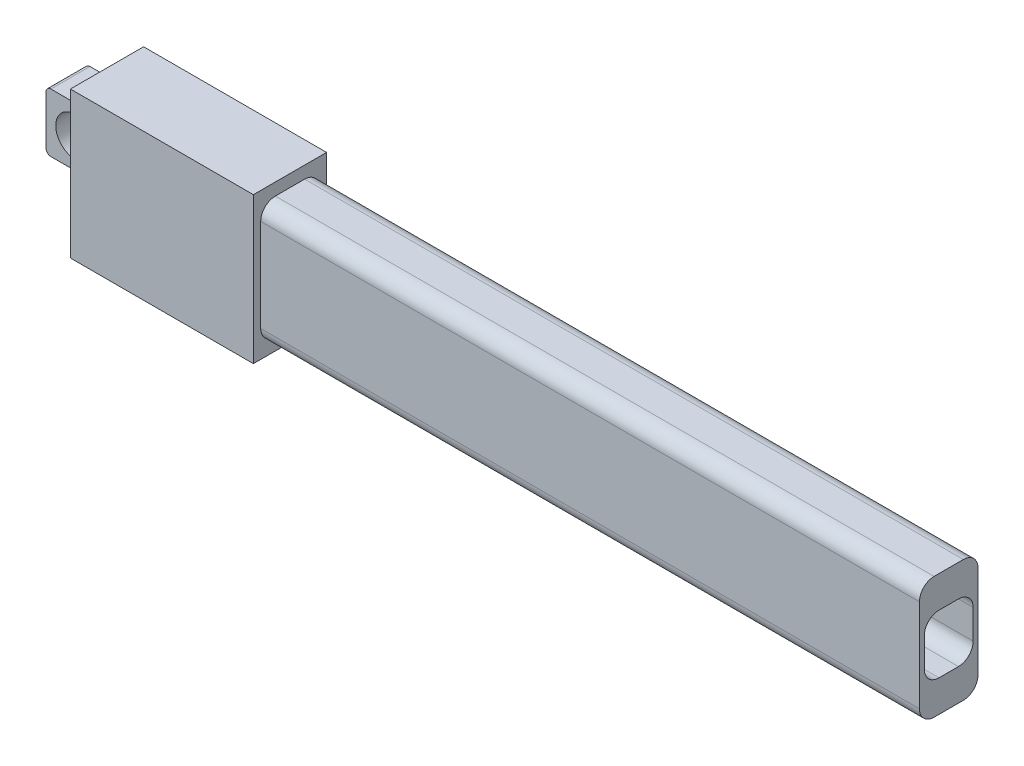
ISO-10303-21;
HEADER;
FILE_DESCRIPTION(('STEP AP214'),'2;1');
FILE_NAME('part.step','',(''),(''),'','','');
FILE_SCHEMA(('AUTOMOTIVE_DESIGN { 1 0 10303 214 1 1 1 1 }'));
ENDSEC;
DATA;
#1=APPLICATION_CONTEXT('core data for automotive mechanical design processes');
#2=APPLICATION_PROTOCOL_DEFINITION('international standard','automotive_design',2000,#1);
#3=PRODUCT_CONTEXT('',#1,'mechanical');
#4=PRODUCT('Part','Part','',(#3));
#5=PRODUCT_RELATED_PRODUCT_CATEGORY('part','',(#4));
#6=PRODUCT_DEFINITION_FORMATION('','',#4);
#7=PRODUCT_DEFINITION_CONTEXT('part definition',#1,'design');
#8=PRODUCT_DEFINITION('design','',#6,#7);
#9=PRODUCT_DEFINITION_SHAPE('','',#8);
#10=(LENGTH_UNIT() NAMED_UNIT(*) SI_UNIT(.MILLI.,.METRE.));
#11=(NAMED_UNIT(*) PLANE_ANGLE_UNIT() SI_UNIT($,.RADIAN.));
#12=(NAMED_UNIT(*) SI_UNIT($,.STERADIAN.) SOLID_ANGLE_UNIT());
#13=UNCERTAINTY_MEASURE_WITH_UNIT(LENGTH_MEASURE(1.E-05),#10,'distance_accuracy_value','');
#14=(GEOMETRIC_REPRESENTATION_CONTEXT(3) GLOBAL_UNCERTAINTY_ASSIGNED_CONTEXT((#13)) GLOBAL_UNIT_ASSIGNED_CONTEXT((#10,
#11,#12)) REPRESENTATION_CONTEXT('',''));
#15=CARTESIAN_POINT('',(0.,0.,0.));
#16=DIRECTION('',(0.,0.,1.));
#17=DIRECTION('',(1.,0.,0.));
#18=AXIS2_PLACEMENT_3D('',#15,#16,#17);
#19=CARTESIAN_POINT('',(18.75,-15.,15.));
#20=DIRECTION('',(-1.,0.,0.));
#21=DIRECTION('',(0.,0.,1.));
#22=AXIS2_PLACEMENT_3D('',#19,#20,#21);
#23=PLANE('',#22);
#24=DIRECTION('',(0.,1.,0.));
#25=VECTOR('',#24,1.);
#26=CARTESIAN_POINT('',(18.75,-15.,0.));
#27=LINE('',#26,#25);
#28=CARTESIAN_POINT('',(18.75,-15.,0.));
#29=VERTEX_POINT('',#28);
#30=CARTESIAN_POINT('',(18.75,15.,0.));
#31=VERTEX_POINT('',#30);
#32=EDGE_CURVE('E394',#29,#31,#27,.T.);
#33=ORIENTED_EDGE('',*,*,#32,.T.);
#34=DIRECTION('',(0.,0.,-1.));
#35=VECTOR('',#34,1.);
#36=CARTESIAN_POINT('',(18.75,15.,15.));
#37=LINE('',#36,#35);
#38=CARTESIAN_POINT('',(18.75,15.,15.));
#39=VERTEX_POINT('',#38);
#40=EDGE_CURVE('E11',#39,#31,#37,.T.);
#41=ORIENTED_EDGE('',*,*,#40,.F.);
#42=DIRECTION('',(0.,1.,0.));
#43=VECTOR('',#42,1.);
#44=CARTESIAN_POINT('',(18.75,-15.,15.));
#45=LINE('',#44,#43);
#46=CARTESIAN_POINT('',(18.75,-15.,15.));
#47=VERTEX_POINT('',#46);
#48=EDGE_CURVE('E395',#47,#39,#45,.T.);
#49=ORIENTED_EDGE('',*,*,#48,.F.);
#50=DIRECTION('',(0.,0.,-1.));
#51=VECTOR('',#50,1.);
#52=CARTESIAN_POINT('',(18.75,-15.,15.));
#53=LINE('',#52,#51);
#54=EDGE_CURVE('E405',#47,#29,#53,.T.);
#55=ORIENTED_EDGE('',*,*,#54,.T.);
#56=EDGE_LOOP('',(#33,#41,#49,#55));
#57=FACE_BOUND('',#56,.T.);
#58=CARTESIAN_POINT('',(18.75,-9.50000000000001,10.5));
#59=DIRECTION('',(1.,0.,0.));
#60=DIRECTION('',(0.,0.,1.));
#61=AXIS2_PLACEMENT_3D('',#58,#59,#60);
#62=CIRCLE('',#61,3.);
#63=CARTESIAN_POINT('',(18.75,-9.50000000000001,13.5));
#64=VERTEX_POINT('',#63);
#65=CARTESIAN_POINT('',(18.75,-12.5,10.5));
#66=VERTEX_POINT('',#65);
#67=EDGE_CURVE('E49',#64,#66,#62,.T.);
#68=ORIENTED_EDGE('',*,*,#67,.F.);
#69=DIRECTION('',(0.,-1.,0.));
#70=VECTOR('',#69,1.);
#71=CARTESIAN_POINT('',(18.75,-9.50000000000001,13.5));
#72=LINE('',#71,#70);
#73=CARTESIAN_POINT('',(18.75,9.5,13.5));
#74=VERTEX_POINT('',#73);
#75=EDGE_CURVE('E53',#74,#64,#72,.T.);
#76=ORIENTED_EDGE('',*,*,#75,.F.);
#77=CARTESIAN_POINT('',(18.75,9.5,10.5));
#78=DIRECTION('',(1.,0.,0.));
#79=DIRECTION('',(0.,0.,1.));
#80=AXIS2_PLACEMENT_3D('',#77,#78,#79);
#81=CIRCLE('',#80,3.);
#82=CARTESIAN_POINT('',(18.75,12.5,10.5));
#83=VERTEX_POINT('',#82);
#84=EDGE_CURVE('E320',#83,#74,#81,.T.);
#85=ORIENTED_EDGE('',*,*,#84,.F.);
#86=DIRECTION('',(0.,0.,1.));
#87=VECTOR('',#86,1.);
#88=CARTESIAN_POINT('',(18.75,12.5,10.5));
#89=LINE('',#88,#87);
#90=CARTESIAN_POINT('',(18.75,12.5,4.5));
#91=VERTEX_POINT('',#90);
#92=EDGE_CURVE('E317',#91,#83,#89,.T.);
#93=ORIENTED_EDGE('',*,*,#92,.F.);
#94=CARTESIAN_POINT('',(18.75,9.5,4.5));
#95=DIRECTION('',(1.,0.,0.));
#96=DIRECTION('',(0.,0.,1.));
#97=AXIS2_PLACEMENT_3D('',#94,#95,#96);
#98=CIRCLE('',#97,3.);
#99=CARTESIAN_POINT('',(18.75,9.5,1.5));
#100=VERTEX_POINT('',#99);
#101=EDGE_CURVE('E314',#100,#91,#98,.T.);
#102=ORIENTED_EDGE('',*,*,#101,.F.);
#103=DIRECTION('',(0.,1.,0.));
#104=VECTOR('',#103,1.);
#105=CARTESIAN_POINT('',(18.75,-9.50000000000001,1.5));
#106=LINE('',#105,#104);
#107=CARTESIAN_POINT('',(18.75,-9.50000000000001,1.5));
#108=VERTEX_POINT('',#107);
#109=EDGE_CURVE('E311',#108,#100,#106,.T.);
#110=ORIENTED_EDGE('',*,*,#109,.F.);
#111=CARTESIAN_POINT('',(18.75,-9.50000000000001,4.5));
#112=DIRECTION('',(1.,0.,0.));
#113=DIRECTION('',(0.,0.,-1.));
#114=AXIS2_PLACEMENT_3D('',#111,#112,#113);
#115=CIRCLE('',#114,3.);
#116=CARTESIAN_POINT('',(18.75,-12.5,4.5));
#117=VERTEX_POINT('',#116);
#118=EDGE_CURVE('E308',#117,#108,#115,.T.);
#119=ORIENTED_EDGE('',*,*,#118,.F.);
#120=DIRECTION('',(0.,0.,-1.));
#121=VECTOR('',#120,1.);
#122=CARTESIAN_POINT('',(18.75,-12.5,10.5));
#123=LINE('',#122,#121);
#124=EDGE_CURVE('E305',#66,#117,#123,.T.);
#125=ORIENTED_EDGE('',*,*,#124,.F.);
#126=EDGE_LOOP('',(#68,#76,#85,#93,#102,#110,#119,#125));
#127=FACE_BOUND('',#126,.T.);
#128=ADVANCED_FACE('F35',(#57,#127),#23,.F.);
#129=CARTESIAN_POINT('',(-18.75,-15.,15.));
#130=DIRECTION('',(1.,0.,0.));
#131=DIRECTION('',(0.,0.,-1.));
#132=AXIS2_PLACEMENT_3D('',#129,#130,#131);
#133=PLANE('',#132);
#134=DIRECTION('',(0.,0.,-1.));
#135=VECTOR('',#134,1.);
#136=CARTESIAN_POINT('',(-18.75,6.,8.));
#137=LINE('',#136,#135);
#138=CARTESIAN_POINT('',(-18.75,6.,8.));
#139=VERTEX_POINT('',#138);
#140=CARTESIAN_POINT('',(-18.75,6.,0.));
#141=VERTEX_POINT('',#140);
#142=EDGE_CURVE('E391',#139,#141,#137,.T.);
#143=ORIENTED_EDGE('',*,*,#142,.F.);
#144=DIRECTION('',(0.,1.,0.));
#145=VECTOR('',#144,1.);
#146=CARTESIAN_POINT('',(-18.75,6.,8.));
#147=LINE('',#146,#145);
#148=CARTESIAN_POINT('',(-18.75,-6.00000000000001,8.));
#149=VERTEX_POINT('',#148);
#150=EDGE_CURVE('E354',#149,#139,#147,.T.);
#151=ORIENTED_EDGE('',*,*,#150,.F.);
#152=DIRECTION('',(0.,0.,-1.));
#153=VECTOR('',#152,1.);
#154=CARTESIAN_POINT('',(-18.75,-6.00000000000001,8.));
#155=LINE('',#154,#153);
#156=CARTESIAN_POINT('',(-18.75,-6.00000000000001,0.));
#157=VERTEX_POINT('',#156);
#158=EDGE_CURVE('E368',#149,#157,#155,.T.);
#159=ORIENTED_EDGE('',*,*,#158,.T.);
#160=DIRECTION('',(0.,-1.,0.));
#161=VECTOR('',#160,1.);
#162=CARTESIAN_POINT('',(-18.75,-15.,0.));
#163=LINE('',#162,#161);
#164=CARTESIAN_POINT('',(-18.75,-15.,0.));
#165=VERTEX_POINT('',#164);
#166=EDGE_CURVE('E410',#157,#165,#163,.T.);
#167=ORIENTED_EDGE('',*,*,#166,.T.);
#168=DIRECTION('',(0.,0.,-1.));
#169=VECTOR('',#168,1.);
#170=CARTESIAN_POINT('',(-18.75,-15.,15.));
#171=LINE('',#170,#169);
#172=CARTESIAN_POINT('',(-18.75,-15.,15.));
#173=VERTEX_POINT('',#172);
#174=EDGE_CURVE('E417',#173,#165,#171,.T.);
#175=ORIENTED_EDGE('',*,*,#174,.F.);
#176=DIRECTION('',(0.,-1.,0.));
#177=VECTOR('',#176,1.);
#178=CARTESIAN_POINT('',(-18.75,-15.,15.));
#179=LINE('',#178,#177);
#180=CARTESIAN_POINT('',(-18.75,15.,15.));
#181=VERTEX_POINT('',#180);
#182=EDGE_CURVE('E401',#181,#173,#179,.T.);
#183=ORIENTED_EDGE('',*,*,#182,.F.);
#184=DIRECTION('',(0.,0.,-1.));
#185=VECTOR('',#184,1.);
#186=CARTESIAN_POINT('',(-18.75,15.,15.));
#187=LINE('',#186,#185);
#188=CARTESIAN_POINT('',(-18.75,15.,0.));
#189=VERTEX_POINT('',#188);
#190=EDGE_CURVE('E42',#181,#189,#187,.T.);
#191=ORIENTED_EDGE('',*,*,#190,.T.);
#192=EDGE_CURVE('E411',#189,#141,#163,.T.);
#193=ORIENTED_EDGE('',*,*,#192,.T.);
#194=EDGE_LOOP('',(#143,#151,#159,#167,#175,#183,#191,#193));
#195=FACE_BOUND('',#194,.T.);
#196=ADVANCED_FACE('F425',(#195),#133,.F.);
#197=CARTESIAN_POINT('',(-18.75,15.,15.));
#198=DIRECTION('',(0.,-1.,0.));
#199=DIRECTION('',(0.,0.,-1.));
#200=AXIS2_PLACEMENT_3D('',#197,#198,#199);
#201=PLANE('',#200);
#202=DIRECTION('',(-1.,0.,0.));
#203=VECTOR('',#202,1.);
#204=CARTESIAN_POINT('',(-18.75,15.,0.));
#205=LINE('',#204,#203);
#206=EDGE_CURVE('E408',#31,#189,#205,.T.);
#207=ORIENTED_EDGE('',*,*,#206,.T.);
#208=ORIENTED_EDGE('',*,*,#190,.F.);
#209=DIRECTION('',(-1.,0.,0.));
#210=VECTOR('',#209,1.);
#211=CARTESIAN_POINT('',(-18.75,15.,15.));
#212=LINE('',#211,#210);
#213=EDGE_CURVE('E398',#39,#181,#212,.T.);
#214=ORIENTED_EDGE('',*,*,#213,.F.);
#215=ORIENTED_EDGE('',*,*,#40,.T.);
#216=EDGE_LOOP('',(#207,#208,#214,#215));
#217=FACE_BOUND('',#216,.T.);
#218=ADVANCED_FACE('F459',(#217),#201,.F.);
#219=CARTESIAN_POINT('',(-18.75,-15.,15.));
#220=DIRECTION('',(0.,1.,0.));
#221=DIRECTION('',(0.,0.,1.));
#222=AXIS2_PLACEMENT_3D('',#219,#220,#221);
#223=PLANE('',#222);
#224=DIRECTION('',(1.,0.,0.));
#225=VECTOR('',#224,1.);
#226=CARTESIAN_POINT('',(-18.75,-15.,0.));
#227=LINE('',#226,#225);
#228=EDGE_CURVE('E399',#165,#29,#227,.T.);
#229=ORIENTED_EDGE('',*,*,#228,.T.);
#230=ORIENTED_EDGE('',*,*,#54,.F.);
#231=DIRECTION('',(1.,0.,0.));
#232=VECTOR('',#231,1.);
#233=CARTESIAN_POINT('',(-18.75,-15.,15.));
#234=LINE('',#233,#232);
#235=EDGE_CURVE('E403',#173,#47,#234,.T.);
#236=ORIENTED_EDGE('',*,*,#235,.F.);
#237=ORIENTED_EDGE('',*,*,#174,.T.);
#238=EDGE_LOOP('',(#229,#230,#236,#237));
#239=FACE_BOUND('',#238,.T.);
#240=ADVANCED_FACE('F453',(#239),#223,.F.);
#241=CARTESIAN_POINT('',(0.,0.,15.));
#242=DIRECTION('',(0.,0.,-1.));
#243=DIRECTION('',(-1.,0.,0.));
#244=AXIS2_PLACEMENT_3D('',#241,#242,#243);
#245=PLANE('',#244);
#246=ORIENTED_EDGE('',*,*,#48,.T.);
#247=ORIENTED_EDGE('',*,*,#213,.T.);
#248=ORIENTED_EDGE('',*,*,#182,.T.);
#249=ORIENTED_EDGE('',*,*,#235,.T.);
#250=EDGE_LOOP('',(#246,#247,#248,#249));
#251=FACE_BOUND('',#250,.T.);
#252=ADVANCED_FACE('F457',(#251),#245,.F.);
#253=CARTESIAN_POINT('',(0.,0.,0.));
#254=DIRECTION('',(0.,0.,-1.));
#255=DIRECTION('',(-1.,0.,0.));
#256=AXIS2_PLACEMENT_3D('',#253,#254,#255);
#257=PLANE('',#256);
#258=ORIENTED_EDGE('',*,*,#32,.F.);
#259=ORIENTED_EDGE('',*,*,#228,.F.);
#260=ORIENTED_EDGE('',*,*,#166,.F.);
#261=DIRECTION('',(1.,0.,0.));
#262=VECTOR('',#261,1.);
#263=CARTESIAN_POINT('',(-18.75,-6.00000000000001,0.));
#264=LINE('',#263,#262);
#265=CARTESIAN_POINT('',(-29.75,-6.00000000000001,0.));
#266=VERTEX_POINT('',#265);
#267=EDGE_CURVE('E358',#266,#157,#264,.T.);
#268=ORIENTED_EDGE('',*,*,#267,.F.);
#269=CARTESIAN_POINT('',(-29.75,-5.,0.));
#270=DIRECTION('',(0.,0.,1.));
#271=DIRECTION('',(-1.,0.,0.));
#272=AXIS2_PLACEMENT_3D('',#269,#270,#271);
#273=CIRCLE('',#272,1.);
#274=CARTESIAN_POINT('',(-30.75,-5.,0.));
#275=VERTEX_POINT('',#274);
#276=EDGE_CURVE('E374',#275,#266,#273,.T.);
#277=ORIENTED_EDGE('',*,*,#276,.F.);
#278=DIRECTION('',(0.,-1.,0.));
#279=VECTOR('',#278,1.);
#280=CARTESIAN_POINT('',(-30.75,5.,0.));
#281=LINE('',#280,#279);
#282=CARTESIAN_POINT('',(-30.75,5.,0.));
#283=VERTEX_POINT('',#282);
#284=EDGE_CURVE('E372',#283,#275,#281,.T.);
#285=ORIENTED_EDGE('',*,*,#284,.F.);
#286=CARTESIAN_POINT('',(-29.75,5.,0.));
#287=DIRECTION('',(0.,0.,1.));
#288=DIRECTION('',(1.,0.,0.));
#289=AXIS2_PLACEMENT_3D('',#286,#287,#288);
#290=CIRCLE('',#289,1.);
#291=CARTESIAN_POINT('',(-29.75,6.,0.));
#292=VERTEX_POINT('',#291);
#293=EDGE_CURVE('E370',#292,#283,#290,.T.);
#294=ORIENTED_EDGE('',*,*,#293,.F.);
#295=DIRECTION('',(-1.,0.,0.));
#296=VECTOR('',#295,1.);
#297=CARTESIAN_POINT('',(-18.75,6.,0.));
#298=LINE('',#297,#296);
#299=EDGE_CURVE('E351',#141,#292,#298,.T.);
#300=ORIENTED_EDGE('',*,*,#299,.F.);
#301=ORIENTED_EDGE('',*,*,#192,.F.);
#302=ORIENTED_EDGE('',*,*,#206,.F.);
#303=EDGE_LOOP('',(#258,#259,#260,#268,#277,#285,#294,#300,#301,#302));
#304=FACE_BOUND('',#303,.T.);
#305=CARTESIAN_POINT('',(-24.75,0.,0.));
#306=DIRECTION('',(0.,0.,1.));
#307=DIRECTION('',(1.,0.,0.));
#308=AXIS2_PLACEMENT_3D('',#305,#306,#307);
#309=CIRCLE('',#308,4.);
#310=CARTESIAN_POINT('',(-20.75,0.,0.));
#311=VERTEX_POINT('',#310);
#312=EDGE_CURVE('E347',#311,#311,#309,.T.);
#313=ORIENTED_EDGE('',*,*,#312,.T.);
#314=EDGE_LOOP('',(#313));
#315=FACE_BOUND('',#314,.T.);
#316=ADVANCED_FACE('F430',(#304,#315),#257,.T.);
#317=CARTESIAN_POINT('',(-29.75,-5.,8.));
#318=DIRECTION('',(0.,0.,-1.));
#319=DIRECTION('',(-1.,0.,0.));
#320=AXIS2_PLACEMENT_3D('',#317,#318,#319);
#321=PLANE('',#320);
#322=ORIENTED_EDGE('',*,*,#150,.T.);
#323=DIRECTION('',(-1.,0.,0.));
#324=VECTOR('',#323,1.);
#325=CARTESIAN_POINT('',(-18.75,6.,8.));
#326=LINE('',#325,#324);
#327=CARTESIAN_POINT('',(-29.75,6.,8.));
#328=VERTEX_POINT('',#327);
#329=EDGE_CURVE('E357',#139,#328,#326,.T.);
#330=ORIENTED_EDGE('',*,*,#329,.T.);
#331=CARTESIAN_POINT('',(-29.75,5.,8.));
#332=DIRECTION('',(0.,0.,1.));
#333=DIRECTION('',(1.,0.,0.));
#334=AXIS2_PLACEMENT_3D('',#331,#332,#333);
#335=CIRCLE('',#334,1.);
#336=CARTESIAN_POINT('',(-30.75,5.,8.));
#337=VERTEX_POINT('',#336);
#338=EDGE_CURVE('E360',#328,#337,#335,.T.);
#339=ORIENTED_EDGE('',*,*,#338,.T.);
#340=DIRECTION('',(0.,-1.,0.));
#341=VECTOR('',#340,1.);
#342=CARTESIAN_POINT('',(-30.75,5.,8.));
#343=LINE('',#342,#341);
#344=CARTESIAN_POINT('',(-30.75,-5.,8.));
#345=VERTEX_POINT('',#344);
#346=EDGE_CURVE('E362',#337,#345,#343,.T.);
#347=ORIENTED_EDGE('',*,*,#346,.T.);
#348=CARTESIAN_POINT('',(-29.75,-5.,8.));
#349=DIRECTION('',(0.,0.,1.));
#350=DIRECTION('',(-1.,0.,0.));
#351=AXIS2_PLACEMENT_3D('',#348,#349,#350);
#352=CIRCLE('',#351,1.);
#353=CARTESIAN_POINT('',(-29.75,-6.00000000000001,8.));
#354=VERTEX_POINT('',#353);
#355=EDGE_CURVE('E364',#345,#354,#352,.T.);
#356=ORIENTED_EDGE('',*,*,#355,.T.);
#357=DIRECTION('',(1.,0.,0.));
#358=VECTOR('',#357,1.);
#359=CARTESIAN_POINT('',(-18.75,-6.00000000000001,8.));
#360=LINE('',#359,#358);
#361=EDGE_CURVE('E366',#354,#149,#360,.T.);
#362=ORIENTED_EDGE('',*,*,#361,.T.);
#363=EDGE_LOOP('',(#322,#330,#339,#347,#356,#362));
#364=FACE_BOUND('',#363,.T.);
#365=CARTESIAN_POINT('',(-24.75,0.,8.));
#366=DIRECTION('',(0.,0.,1.));
#367=DIRECTION('',(1.,0.,0.));
#368=AXIS2_PLACEMENT_3D('',#365,#366,#367);
#369=CIRCLE('',#368,4.);
#370=CARTESIAN_POINT('',(-20.75,0.,8.));
#371=VERTEX_POINT('',#370);
#372=EDGE_CURVE('E348',#371,#371,#369,.T.);
#373=ORIENTED_EDGE('',*,*,#372,.F.);
#374=EDGE_LOOP('',(#373));
#375=FACE_BOUND('',#374,.T.);
#376=ADVANCED_FACE('F441',(#364,#375),#321,.F.);
#377=CARTESIAN_POINT('',(-18.75,6.,8.));
#378=DIRECTION('',(0.,-1.,0.));
#379=DIRECTION('',(1.,0.,0.));
#380=AXIS2_PLACEMENT_3D('',#377,#378,#379);
#381=PLANE('',#380);
#382=ORIENTED_EDGE('',*,*,#299,.T.);
#383=DIRECTION('',(0.,0.,-1.));
#384=VECTOR('',#383,1.);
#385=CARTESIAN_POINT('',(-29.75,6.,8.));
#386=LINE('',#385,#384);
#387=EDGE_CURVE('E388',#328,#292,#386,.T.);
#388=ORIENTED_EDGE('',*,*,#387,.F.);
#389=ORIENTED_EDGE('',*,*,#329,.F.);
#390=ORIENTED_EDGE('',*,*,#142,.T.);
#391=EDGE_LOOP('',(#382,#388,#389,#390));
#392=FACE_BOUND('',#391,.T.);
#393=ADVANCED_FACE('F436',(#392),#381,.F.);
#394=CARTESIAN_POINT('',(-29.75,5.,8.));
#395=DIRECTION('',(0.,0.,-1.));
#396=DIRECTION('',(-1.,0.,0.));
#397=AXIS2_PLACEMENT_3D('',#394,#395,#396);
#398=CYLINDRICAL_SURFACE('',#397,1.);
#399=ORIENTED_EDGE('',*,*,#293,.T.);
#400=DIRECTION('',(0.,0.,-1.));
#401=VECTOR('',#400,1.);
#402=CARTESIAN_POINT('',(-30.75,5.,8.));
#403=LINE('',#402,#401);
#404=EDGE_CURVE('E385',#337,#283,#403,.T.);
#405=ORIENTED_EDGE('',*,*,#404,.F.);
#406=ORIENTED_EDGE('',*,*,#338,.F.);
#407=ORIENTED_EDGE('',*,*,#387,.T.);
#408=EDGE_LOOP('',(#399,#405,#406,#407));
#409=FACE_BOUND('',#408,.T.);
#410=ADVANCED_FACE('F478',(#409),#398,.T.);
#411=CARTESIAN_POINT('',(-30.75,5.,8.));
#412=DIRECTION('',(1.,0.,0.));
#413=DIRECTION('',(0.,0.,-1.));
#414=AXIS2_PLACEMENT_3D('',#411,#412,#413);
#415=PLANE('',#414);
#416=ORIENTED_EDGE('',*,*,#284,.T.);
#417=DIRECTION('',(0.,0.,-1.));
#418=VECTOR('',#417,1.);
#419=CARTESIAN_POINT('',(-30.75,-5.,8.));
#420=LINE('',#419,#418);
#421=EDGE_CURVE('E382',#345,#275,#420,.T.);
#422=ORIENTED_EDGE('',*,*,#421,.F.);
#423=ORIENTED_EDGE('',*,*,#346,.F.);
#424=ORIENTED_EDGE('',*,*,#404,.T.);
#425=EDGE_LOOP('',(#416,#422,#423,#424));
#426=FACE_BOUND('',#425,.T.);
#427=ADVANCED_FACE('F481',(#426),#415,.F.);
#428=CARTESIAN_POINT('',(-29.75,-5.,8.));
#429=DIRECTION('',(0.,0.,-1.));
#430=DIRECTION('',(-1.,0.,0.));
#431=AXIS2_PLACEMENT_3D('',#428,#429,#430);
#432=CYLINDRICAL_SURFACE('',#431,1.);
#433=ORIENTED_EDGE('',*,*,#276,.T.);
#434=DIRECTION('',(0.,0.,-1.));
#435=VECTOR('',#434,1.);
#436=CARTESIAN_POINT('',(-29.75,-6.00000000000001,8.));
#437=LINE('',#436,#435);
#438=EDGE_CURVE('E379',#354,#266,#437,.T.);
#439=ORIENTED_EDGE('',*,*,#438,.F.);
#440=ORIENTED_EDGE('',*,*,#355,.F.);
#441=ORIENTED_EDGE('',*,*,#421,.T.);
#442=EDGE_LOOP('',(#433,#439,#440,#441));
#443=FACE_BOUND('',#442,.T.);
#444=ADVANCED_FACE('F485',(#443),#432,.T.);
#445=CARTESIAN_POINT('',(-18.75,-6.00000000000001,8.));
#446=DIRECTION('',(0.,1.,0.));
#447=DIRECTION('',(0.,0.,1.));
#448=AXIS2_PLACEMENT_3D('',#445,#446,#447);
#449=PLANE('',#448);
#450=ORIENTED_EDGE('',*,*,#267,.T.);
#451=ORIENTED_EDGE('',*,*,#158,.F.);
#452=ORIENTED_EDGE('',*,*,#361,.F.);
#453=ORIENTED_EDGE('',*,*,#438,.T.);
#454=EDGE_LOOP('',(#450,#451,#452,#453));
#455=FACE_BOUND('',#454,.T.);
#456=ADVANCED_FACE('F447',(#455),#449,.F.);
#457=CARTESIAN_POINT('',(-24.75,0.,8.));
#458=DIRECTION('',(0.,0.,-1.));
#459=DIRECTION('',(-1.,0.,0.));
#460=AXIS2_PLACEMENT_3D('',#457,#458,#459);
#461=CYLINDRICAL_SURFACE('',#460,4.);
#462=ORIENTED_EDGE('',*,*,#372,.T.);
#463=EDGE_LOOP('',(#462));
#464=FACE_BOUND('',#463,.T.);
#465=ORIENTED_EDGE('',*,*,#312,.F.);
#466=EDGE_LOOP('',(#465));
#467=FACE_BOUND('',#466,.T.);
#468=ADVANCED_FACE('F492',(#464,#467),#461,.F.);
#469=CARTESIAN_POINT('',(53.75,-9.50000000000001,10.5));
#470=DIRECTION('',(-1.,0.,0.));
#471=DIRECTION('',(0.,0.,1.));
#472=AXIS2_PLACEMENT_3D('',#469,#470,#471);
#473=CYLINDRICAL_SURFACE('',#472,3.);
#474=ORIENTED_EDGE('',*,*,#67,.T.);
#475=DIRECTION('',(-1.,0.,0.));
#476=VECTOR('',#475,1.);
#477=CARTESIAN_POINT('',(53.75,-12.5,10.5));
#478=LINE('',#477,#476);
#479=CARTESIAN_POINT('',(153.75,-12.5,10.5));
#480=VERTEX_POINT('',#479);
#481=EDGE_CURVE('E344',#480,#66,#478,.T.);
#482=ORIENTED_EDGE('',*,*,#481,.F.);
#483=CARTESIAN_POINT('',(153.75,-9.50000000000001,10.5));
#484=DIRECTION('',(1.,0.,0.));
#485=DIRECTION('',(0.,0.,-1.));
#486=AXIS2_PLACEMENT_3D('',#483,#484,#485);
#487=CIRCLE('',#486,3.);
#488=CARTESIAN_POINT('',(153.75,-9.50000000000001,13.5));
#489=VERTEX_POINT('',#488);
#490=EDGE_CURVE('E254',#489,#480,#487,.T.);
#491=ORIENTED_EDGE('',*,*,#490,.F.);
#492=DIRECTION('',(-1.,0.,0.));
#493=VECTOR('',#492,1.);
#494=CARTESIAN_POINT('',(53.75,-9.50000000000001,13.5));
#495=LINE('',#494,#493);
#496=EDGE_CURVE('E323',#489,#64,#495,.T.);
#497=ORIENTED_EDGE('',*,*,#496,.T.);
#498=EDGE_LOOP('',(#474,#482,#491,#497));
#499=FACE_BOUND('',#498,.T.);
#500=ADVANCED_FACE('F497',(#499),#473,.T.);
#501=CARTESIAN_POINT('',(53.75,-12.5,10.5));
#502=DIRECTION('',(0.,1.,0.));
#503=DIRECTION('',(0.,0.,1.));
#504=AXIS2_PLACEMENT_3D('',#501,#502,#503);
#505=PLANE('',#504);
#506=ORIENTED_EDGE('',*,*,#124,.T.);
#507=DIRECTION('',(-1.,0.,0.));
#508=VECTOR('',#507,1.);
#509=CARTESIAN_POINT('',(53.75,-12.5,4.5));
#510=LINE('',#509,#508);
#511=CARTESIAN_POINT('',(153.75,-12.5,4.5));
#512=VERTEX_POINT('',#511);
#513=EDGE_CURVE('E341',#512,#117,#510,.T.);
#514=ORIENTED_EDGE('',*,*,#513,.F.);
#515=DIRECTION('',(0.,0.,-1.));
#516=VECTOR('',#515,1.);
#517=CARTESIAN_POINT('',(153.75,-12.5,10.5));
#518=LINE('',#517,#516);
#519=EDGE_CURVE('E257',#480,#512,#518,.T.);
#520=ORIENTED_EDGE('',*,*,#519,.F.);
#521=ORIENTED_EDGE('',*,*,#481,.T.);
#522=EDGE_LOOP('',(#506,#514,#520,#521));
#523=FACE_BOUND('',#522,.T.);
#524=ADVANCED_FACE('F501',(#523),#505,.F.);
#525=CARTESIAN_POINT('',(53.75,-9.50000000000001,4.5));
#526=DIRECTION('',(-1.,0.,0.));
#527=DIRECTION('',(0.,0.,1.));
#528=AXIS2_PLACEMENT_3D('',#525,#526,#527);
#529=CYLINDRICAL_SURFACE('',#528,3.);
#530=ORIENTED_EDGE('',*,*,#118,.T.);
#531=DIRECTION('',(-1.,0.,0.));
#532=VECTOR('',#531,1.);
#533=CARTESIAN_POINT('',(53.75,-9.50000000000001,1.5));
#534=LINE('',#533,#532);
#535=CARTESIAN_POINT('',(153.75,-9.50000000000001,1.5));
#536=VERTEX_POINT('',#535);
#537=EDGE_CURVE('E338',#536,#108,#534,.T.);
#538=ORIENTED_EDGE('',*,*,#537,.F.);
#539=CARTESIAN_POINT('',(153.75,-9.50000000000001,4.5));
#540=DIRECTION('',(1.,0.,0.));
#541=DIRECTION('',(0.,0.,-1.));
#542=AXIS2_PLACEMENT_3D('',#539,#540,#541);
#543=CIRCLE('',#542,3.);
#544=EDGE_CURVE('E260',#512,#536,#543,.T.);
#545=ORIENTED_EDGE('',*,*,#544,.F.);
#546=ORIENTED_EDGE('',*,*,#513,.T.);
#547=EDGE_LOOP('',(#530,#538,#545,#546));
#548=FACE_BOUND('',#547,.T.);
#549=ADVANCED_FACE('F505',(#548),#529,.T.);
#550=CARTESIAN_POINT('',(53.75,-9.50000000000001,1.5));
#551=DIRECTION('',(0.,0.,1.));
#552=DIRECTION('',(1.,0.,0.));
#553=AXIS2_PLACEMENT_3D('',#550,#551,#552);
#554=PLANE('',#553);
#555=ORIENTED_EDGE('',*,*,#109,.T.);
#556=DIRECTION('',(-1.,0.,0.));
#557=VECTOR('',#556,1.);
#558=CARTESIAN_POINT('',(53.75,9.5,1.5));
#559=LINE('',#558,#557);
#560=CARTESIAN_POINT('',(153.75,9.5,1.5));
#561=VERTEX_POINT('',#560);
#562=EDGE_CURVE('E335',#561,#100,#559,.T.);
#563=ORIENTED_EDGE('',*,*,#562,.F.);
#564=DIRECTION('',(0.,1.,0.));
#565=VECTOR('',#564,1.);
#566=CARTESIAN_POINT('',(153.75,-9.50000000000001,1.5));
#567=LINE('',#566,#565);
#568=EDGE_CURVE('E263',#536,#561,#567,.T.);
#569=ORIENTED_EDGE('',*,*,#568,.F.);
#570=ORIENTED_EDGE('',*,*,#537,.T.);
#571=EDGE_LOOP('',(#555,#563,#569,#570));
#572=FACE_BOUND('',#571,.T.);
#573=ADVANCED_FACE('F509',(#572),#554,.F.);
#574=CARTESIAN_POINT('',(53.75,9.5,4.5));
#575=DIRECTION('',(-1.,0.,0.));
#576=DIRECTION('',(0.,0.,1.));
#577=AXIS2_PLACEMENT_3D('',#574,#575,#576);
#578=CYLINDRICAL_SURFACE('',#577,3.);
#579=ORIENTED_EDGE('',*,*,#101,.T.);
#580=DIRECTION('',(-1.,0.,0.));
#581=VECTOR('',#580,1.);
#582=CARTESIAN_POINT('',(53.75,12.5,4.5));
#583=LINE('',#582,#581);
#584=CARTESIAN_POINT('',(153.75,12.5,4.5));
#585=VERTEX_POINT('',#584);
#586=EDGE_CURVE('E332',#585,#91,#583,.T.);
#587=ORIENTED_EDGE('',*,*,#586,.F.);
#588=CARTESIAN_POINT('',(153.75,9.5,4.5));
#589=DIRECTION('',(1.,0.,0.));
#590=DIRECTION('',(0.,0.,-1.));
#591=AXIS2_PLACEMENT_3D('',#588,#589,#590);
#592=CIRCLE('',#591,3.);
#593=EDGE_CURVE('E266',#561,#585,#592,.T.);
#594=ORIENTED_EDGE('',*,*,#593,.F.);
#595=ORIENTED_EDGE('',*,*,#562,.T.);
#596=EDGE_LOOP('',(#579,#587,#594,#595));
#597=FACE_BOUND('',#596,.T.);
#598=ADVANCED_FACE('F513',(#597),#578,.T.);
#599=CARTESIAN_POINT('',(53.75,12.5,10.5));
#600=DIRECTION('',(0.,-1.,0.));
#601=DIRECTION('',(0.,0.,-1.));
#602=AXIS2_PLACEMENT_3D('',#599,#600,#601);
#603=PLANE('',#602);
#604=ORIENTED_EDGE('',*,*,#92,.T.);
#605=DIRECTION('',(-1.,0.,0.));
#606=VECTOR('',#605,1.);
#607=CARTESIAN_POINT('',(53.75,12.5,10.5));
#608=LINE('',#607,#606);
#609=CARTESIAN_POINT('',(153.75,12.5,10.5));
#610=VERTEX_POINT('',#609);
#611=EDGE_CURVE('E329',#610,#83,#608,.T.);
#612=ORIENTED_EDGE('',*,*,#611,.F.);
#613=DIRECTION('',(0.,0.,1.));
#614=VECTOR('',#613,1.);
#615=CARTESIAN_POINT('',(153.75,12.5,4.5));
#616=LINE('',#615,#614);
#617=EDGE_CURVE('E269',#585,#610,#616,.T.);
#618=ORIENTED_EDGE('',*,*,#617,.F.);
#619=ORIENTED_EDGE('',*,*,#586,.T.);
#620=EDGE_LOOP('',(#604,#612,#618,#619));
#621=FACE_BOUND('',#620,.T.);
#622=ADVANCED_FACE('F517',(#621),#603,.F.);
#623=CARTESIAN_POINT('',(53.75,9.5,10.5));
#624=DIRECTION('',(-1.,0.,0.));
#625=DIRECTION('',(0.,0.,1.));
#626=AXIS2_PLACEMENT_3D('',#623,#624,#625);
#627=CYLINDRICAL_SURFACE('',#626,3.);
#628=ORIENTED_EDGE('',*,*,#84,.T.);
#629=DIRECTION('',(-1.,0.,0.));
#630=VECTOR('',#629,1.);
#631=CARTESIAN_POINT('',(53.75,9.5,13.5));
#632=LINE('',#631,#630);
#633=CARTESIAN_POINT('',(153.75,9.5,13.5));
#634=VERTEX_POINT('',#633);
#635=EDGE_CURVE('E326',#634,#74,#632,.T.);
#636=ORIENTED_EDGE('',*,*,#635,.F.);
#637=CARTESIAN_POINT('',(153.75,9.5,10.5));
#638=DIRECTION('',(1.,0.,0.));
#639=DIRECTION('',(0.,0.,-1.));
#640=AXIS2_PLACEMENT_3D('',#637,#638,#639);
#641=CIRCLE('',#640,3.);
#642=EDGE_CURVE('E248',#610,#634,#641,.T.);
#643=ORIENTED_EDGE('',*,*,#642,.F.);
#644=ORIENTED_EDGE('',*,*,#611,.T.);
#645=EDGE_LOOP('',(#628,#636,#643,#644));
#646=FACE_BOUND('',#645,.T.);
#647=ADVANCED_FACE('F521',(#646),#627,.T.);
#648=CARTESIAN_POINT('',(53.75,-9.50000000000001,13.5));
#649=DIRECTION('',(0.,0.,-1.));
#650=DIRECTION('',(-1.,0.,0.));
#651=AXIS2_PLACEMENT_3D('',#648,#649,#650);
#652=PLANE('',#651);
#653=ORIENTED_EDGE('',*,*,#75,.T.);
#654=ORIENTED_EDGE('',*,*,#496,.F.);
#655=DIRECTION('',(0.,-1.,0.));
#656=VECTOR('',#655,1.);
#657=CARTESIAN_POINT('',(153.75,9.5,13.5));
#658=LINE('',#657,#656);
#659=EDGE_CURVE('E251',#634,#489,#658,.T.);
#660=ORIENTED_EDGE('',*,*,#659,.F.);
#661=ORIENTED_EDGE('',*,*,#635,.T.);
#662=EDGE_LOOP('',(#653,#654,#660,#661));
#663=FACE_BOUND('',#662,.T.);
#664=ADVANCED_FACE('F525',(#663),#652,.F.);
#665=CARTESIAN_POINT('',(153.75,9.5,10.5));
#666=DIRECTION('',(1.,0.,0.));
#667=DIRECTION('',(0.,0.,-1.));
#668=AXIS2_PLACEMENT_3D('',#665,#666,#667);
#669=PLANE('',#668);
#670=ORIENTED_EDGE('',*,*,#642,.T.);
#671=ORIENTED_EDGE('',*,*,#659,.T.);
#672=ORIENTED_EDGE('',*,*,#490,.T.);
#673=ORIENTED_EDGE('',*,*,#519,.T.);
#674=ORIENTED_EDGE('',*,*,#544,.T.);
#675=ORIENTED_EDGE('',*,*,#568,.T.);
#676=ORIENTED_EDGE('',*,*,#593,.T.);
#677=ORIENTED_EDGE('',*,*,#617,.T.);
#678=EDGE_LOOP('',(#670,#671,#672,#673,#674,#675,#676,#677));
#679=FACE_BOUND('',#678,.T.);
#680=DIRECTION('',(0.,1.,0.));
#681=VECTOR('',#680,1.);
#682=CARTESIAN_POINT('',(153.75,-2.99999999999998,2.5));
#683=LINE('',#682,#681);
#684=CARTESIAN_POINT('',(153.75,-2.99999999999998,2.5));
#685=VERTEX_POINT('',#684);
#686=CARTESIAN_POINT('',(153.75,2.99999999999998,2.5));
#687=VERTEX_POINT('',#686);
#688=EDGE_CURVE('E209',#685,#687,#683,.T.);
#689=ORIENTED_EDGE('',*,*,#688,.F.);
#690=CARTESIAN_POINT('',(153.75,-3.,5.5));
#691=DIRECTION('',(1.,0.,0.));
#692=DIRECTION('',(0.,0.,-1.));
#693=AXIS2_PLACEMENT_3D('',#690,#691,#692);
#694=CIRCLE('',#693,3.);
#695=CARTESIAN_POINT('',(153.75,-6.,5.50000000000002));
#696=VERTEX_POINT('',#695);
#697=EDGE_CURVE('E220',#696,#685,#694,.T.);
#698=ORIENTED_EDGE('',*,*,#697,.F.);
#699=DIRECTION('',(0.,0.,-1.));
#700=VECTOR('',#699,1.);
#701=CARTESIAN_POINT('',(153.75,-6.,9.49999999999998));
#702=LINE('',#701,#700);
#703=CARTESIAN_POINT('',(153.75,-6.,9.49999999999998));
#704=VERTEX_POINT('',#703);
#705=EDGE_CURVE('E246',#704,#696,#702,.T.);
#706=ORIENTED_EDGE('',*,*,#705,.F.);
#707=CARTESIAN_POINT('',(153.75,-3.,9.50000000000001));
#708=DIRECTION('',(1.,0.,0.));
#709=DIRECTION('',(0.,0.,-1.));
#710=AXIS2_PLACEMENT_3D('',#707,#708,#709);
#711=CIRCLE('',#710,3.);
#712=CARTESIAN_POINT('',(153.75,-3.,12.5));
#713=VERTEX_POINT('',#712);
#714=EDGE_CURVE('E243',#713,#704,#711,.T.);
#715=ORIENTED_EDGE('',*,*,#714,.F.);
#716=DIRECTION('',(0.,-1.,0.));
#717=VECTOR('',#716,1.);
#718=CARTESIAN_POINT('',(153.75,2.99999999999998,12.5));
#719=LINE('',#718,#717);
#720=CARTESIAN_POINT('',(153.75,2.99999999999998,12.5));
#721=VERTEX_POINT('',#720);
#722=EDGE_CURVE('E240',#721,#713,#719,.T.);
#723=ORIENTED_EDGE('',*,*,#722,.F.);
#724=CARTESIAN_POINT('',(153.75,3.,9.50000000000001));
#725=DIRECTION('',(1.,0.,0.));
#726=DIRECTION('',(0.,0.,-1.));
#727=AXIS2_PLACEMENT_3D('',#724,#725,#726);
#728=CIRCLE('',#727,3.);
#729=CARTESIAN_POINT('',(153.75,6.,9.49999999999998));
#730=VERTEX_POINT('',#729);
#731=EDGE_CURVE('E237',#730,#721,#728,.T.);
#732=ORIENTED_EDGE('',*,*,#731,.F.);
#733=DIRECTION('',(0.,0.,1.));
#734=VECTOR('',#733,1.);
#735=CARTESIAN_POINT('',(153.75,6.,5.50000000000002));
#736=LINE('',#735,#734);
#737=CARTESIAN_POINT('',(153.75,6.,5.50000000000002));
#738=VERTEX_POINT('',#737);
#739=EDGE_CURVE('E232',#738,#730,#736,.T.);
#740=ORIENTED_EDGE('',*,*,#739,.F.);
#741=CARTESIAN_POINT('',(153.75,3.,5.5));
#742=DIRECTION('',(1.,0.,0.));
#743=DIRECTION('',(0.,0.,-1.));
#744=AXIS2_PLACEMENT_3D('',#741,#742,#743);
#745=CIRCLE('',#744,3.);
#746=EDGE_CURVE('E230',#687,#738,#745,.T.);
#747=ORIENTED_EDGE('',*,*,#746,.F.);
#748=EDGE_LOOP('',(#689,#698,#706,#715,#723,#732,#740,#747));
#749=FACE_BOUND('',#748,.T.);
#750=ADVANCED_FACE('F227',(#679,#749),#669,.T.);
#751=CARTESIAN_POINT('',(23.75,-3.,5.5));
#752=DIRECTION('',(1.,0.,0.));
#753=DIRECTION('',(0.,0.,-1.));
#754=AXIS2_PLACEMENT_3D('',#751,#752,#753);
#755=PLANE('',#754);
#756=CARTESIAN_POINT('',(23.75,-3.,5.5));
#757=DIRECTION('',(1.,0.,0.));
#758=DIRECTION('',(0.,0.,-1.));
#759=AXIS2_PLACEMENT_3D('',#756,#757,#758);
#760=CIRCLE('',#759,3.);
#761=CARTESIAN_POINT('',(23.75,-6.,5.50000000000002));
#762=VERTEX_POINT('',#761);
#763=CARTESIAN_POINT('',(23.75,-2.99999999999998,2.5));
#764=VERTEX_POINT('',#763);
#765=EDGE_CURVE('E272',#762,#764,#760,.T.);
#766=ORIENTED_EDGE('',*,*,#765,.T.);
#767=DIRECTION('',(0.,1.,0.));
#768=VECTOR('',#767,1.);
#769=CARTESIAN_POINT('',(23.75,-2.99999999999998,2.5));
#770=LINE('',#769,#768);
#771=CARTESIAN_POINT('',(23.75,2.99999999999998,2.5));
#772=VERTEX_POINT('',#771);
#773=EDGE_CURVE('E212',#764,#772,#770,.T.);
#774=ORIENTED_EDGE('',*,*,#773,.T.);
#775=CARTESIAN_POINT('',(23.75,3.,5.5));
#776=DIRECTION('',(1.,0.,0.));
#777=DIRECTION('',(0.,0.,1.));
#778=AXIS2_PLACEMENT_3D('',#775,#776,#777);
#779=CIRCLE('',#778,3.);
#780=CARTESIAN_POINT('',(23.75,6.,5.50000000000002));
#781=VERTEX_POINT('',#780);
#782=EDGE_CURVE('E275',#772,#781,#779,.T.);
#783=ORIENTED_EDGE('',*,*,#782,.T.);
#784=DIRECTION('',(0.,0.,1.));
#785=VECTOR('',#784,1.);
#786=CARTESIAN_POINT('',(23.75,6.,9.49999999999998));
#787=LINE('',#786,#785);
#788=CARTESIAN_POINT('',(23.75,6.,9.49999999999998));
#789=VERTEX_POINT('',#788);
#790=EDGE_CURVE('E278',#781,#789,#787,.T.);
#791=ORIENTED_EDGE('',*,*,#790,.T.);
#792=CARTESIAN_POINT('',(23.75,3.,9.50000000000001));
#793=DIRECTION('',(1.,0.,0.));
#794=DIRECTION('',(0.,0.,1.));
#795=AXIS2_PLACEMENT_3D('',#792,#793,#794);
#796=CIRCLE('',#795,3.);
#797=CARTESIAN_POINT('',(23.75,2.99999999999998,12.5));
#798=VERTEX_POINT('',#797);
#799=EDGE_CURVE('E281',#789,#798,#796,.T.);
#800=ORIENTED_EDGE('',*,*,#799,.T.);
#801=DIRECTION('',(0.,-1.,0.));
#802=VECTOR('',#801,1.);
#803=CARTESIAN_POINT('',(23.75,-2.99999999999998,12.5));
#804=LINE('',#803,#802);
#805=CARTESIAN_POINT('',(23.75,-3.,12.5));
#806=VERTEX_POINT('',#805);
#807=EDGE_CURVE('E284',#798,#806,#804,.T.);
#808=ORIENTED_EDGE('',*,*,#807,.T.);
#809=CARTESIAN_POINT('',(23.75,-3.,9.50000000000001));
#810=DIRECTION('',(1.,0.,0.));
#811=DIRECTION('',(0.,0.,1.));
#812=AXIS2_PLACEMENT_3D('',#809,#810,#811);
#813=CIRCLE('',#812,3.);
#814=CARTESIAN_POINT('',(23.75,-6.,9.49999999999998));
#815=VERTEX_POINT('',#814);
#816=EDGE_CURVE('E287',#806,#815,#813,.T.);
#817=ORIENTED_EDGE('',*,*,#816,.T.);
#818=DIRECTION('',(0.,0.,-1.));
#819=VECTOR('',#818,1.);
#820=CARTESIAN_POINT('',(23.75,-6.,9.49999999999998));
#821=LINE('',#820,#819);
#822=EDGE_CURVE('E217',#815,#762,#821,.T.);
#823=ORIENTED_EDGE('',*,*,#822,.T.);
#824=EDGE_LOOP('',(#766,#774,#783,#791,#800,#808,#817,#823));
#825=FACE_BOUND('',#824,.T.);
#826=ADVANCED_FACE('F539',(#825),#755,.T.);
#827=CARTESIAN_POINT('',(23.75,3.,5.5));
#828=DIRECTION('',(1.,0.,0.));
#829=DIRECTION('',(0.,0.,-1.));
#830=AXIS2_PLACEMENT_3D('',#827,#828,#829);
#831=CYLINDRICAL_SURFACE('',#830,3.);
#832=DIRECTION('',(1.,0.,0.));
#833=VECTOR('',#832,1.);
#834=CARTESIAN_POINT('',(23.75,2.99999999999998,2.5));
#835=LINE('',#834,#833);
#836=EDGE_CURVE('E216',#772,#687,#835,.T.);
#837=ORIENTED_EDGE('',*,*,#836,.T.);
#838=ORIENTED_EDGE('',*,*,#746,.T.);
#839=DIRECTION('',(1.,0.,0.));
#840=VECTOR('',#839,1.);
#841=CARTESIAN_POINT('',(23.75,6.,5.50000000000002));
#842=LINE('',#841,#840);
#843=EDGE_CURVE('E301',#781,#738,#842,.T.);
#844=ORIENTED_EDGE('',*,*,#843,.F.);
#845=ORIENTED_EDGE('',*,*,#782,.F.);
#846=EDGE_LOOP('',(#837,#838,#844,#845));
#847=FACE_BOUND('',#846,.T.);
#848=ADVANCED_FACE('F535',(#847),#831,.F.);
#849=CARTESIAN_POINT('',(23.75,6.,9.49999999999998));
#850=DIRECTION('',(0.,1.,0.));
#851=DIRECTION('',(0.,0.,1.));
#852=AXIS2_PLACEMENT_3D('',#849,#850,#851);
#853=PLANE('',#852);
#854=ORIENTED_EDGE('',*,*,#843,.T.);
#855=ORIENTED_EDGE('',*,*,#739,.T.);
#856=DIRECTION('',(1.,0.,0.));
#857=VECTOR('',#856,1.);
#858=CARTESIAN_POINT('',(23.75,6.,9.49999999999998));
#859=LINE('',#858,#857);
#860=EDGE_CURVE('E299',#789,#730,#859,.T.);
#861=ORIENTED_EDGE('',*,*,#860,.F.);
#862=ORIENTED_EDGE('',*,*,#790,.F.);
#863=EDGE_LOOP('',(#854,#855,#861,#862));
#864=FACE_BOUND('',#863,.T.);
#865=ADVANCED_FACE('F538',(#864),#853,.F.);
#866=CARTESIAN_POINT('',(23.75,3.,9.50000000000001));
#867=DIRECTION('',(1.,0.,0.));
#868=DIRECTION('',(0.,0.,-1.));
#869=AXIS2_PLACEMENT_3D('',#866,#867,#868);
#870=CYLINDRICAL_SURFACE('',#869,3.);
#871=ORIENTED_EDGE('',*,*,#860,.T.);
#872=ORIENTED_EDGE('',*,*,#731,.T.);
#873=DIRECTION('',(1.,0.,0.));
#874=VECTOR('',#873,1.);
#875=CARTESIAN_POINT('',(23.75,2.99999999999998,12.5));
#876=LINE('',#875,#874);
#877=EDGE_CURVE('E297',#798,#721,#876,.T.);
#878=ORIENTED_EDGE('',*,*,#877,.F.);
#879=ORIENTED_EDGE('',*,*,#799,.F.);
#880=EDGE_LOOP('',(#871,#872,#878,#879));
#881=FACE_BOUND('',#880,.T.);
#882=ADVANCED_FACE('F543',(#881),#870,.F.);
#883=CARTESIAN_POINT('',(23.75,-2.99999999999998,12.5));
#884=DIRECTION('',(0.,0.,1.));
#885=DIRECTION('',(1.,0.,0.));
#886=AXIS2_PLACEMENT_3D('',#883,#884,#885);
#887=PLANE('',#886);
#888=ORIENTED_EDGE('',*,*,#877,.T.);
#889=ORIENTED_EDGE('',*,*,#722,.T.);
#890=DIRECTION('',(1.,0.,0.));
#891=VECTOR('',#890,1.);
#892=CARTESIAN_POINT('',(23.75,-3.,12.5));
#893=LINE('',#892,#891);
#894=EDGE_CURVE('E295',#806,#713,#893,.T.);
#895=ORIENTED_EDGE('',*,*,#894,.F.);
#896=ORIENTED_EDGE('',*,*,#807,.F.);
#897=EDGE_LOOP('',(#888,#889,#895,#896));
#898=FACE_BOUND('',#897,.T.);
#899=ADVANCED_FACE('F547',(#898),#887,.F.);
#900=CARTESIAN_POINT('',(23.75,-3.,9.50000000000001));
#901=DIRECTION('',(1.,0.,0.));
#902=DIRECTION('',(0.,0.,-1.));
#903=AXIS2_PLACEMENT_3D('',#900,#901,#902);
#904=CYLINDRICAL_SURFACE('',#903,3.);
#905=ORIENTED_EDGE('',*,*,#894,.T.);
#906=ORIENTED_EDGE('',*,*,#714,.T.);
#907=DIRECTION('',(1.,0.,0.));
#908=VECTOR('',#907,1.);
#909=CARTESIAN_POINT('',(23.75,-6.,9.49999999999998));
#910=LINE('',#909,#908);
#911=EDGE_CURVE('E293',#815,#704,#910,.T.);
#912=ORIENTED_EDGE('',*,*,#911,.F.);
#913=ORIENTED_EDGE('',*,*,#816,.F.);
#914=EDGE_LOOP('',(#905,#906,#912,#913));
#915=FACE_BOUND('',#914,.T.);
#916=ADVANCED_FACE('F551',(#915),#904,.F.);
#917=CARTESIAN_POINT('',(23.75,-6.,9.49999999999998));
#918=DIRECTION('',(0.,-1.,0.));
#919=DIRECTION('',(0.,0.,-1.));
#920=AXIS2_PLACEMENT_3D('',#917,#918,#919);
#921=PLANE('',#920);
#922=ORIENTED_EDGE('',*,*,#911,.T.);
#923=ORIENTED_EDGE('',*,*,#705,.T.);
#924=DIRECTION('',(1.,0.,0.));
#925=VECTOR('',#924,1.);
#926=CARTESIAN_POINT('',(23.75,-6.,5.50000000000002));
#927=LINE('',#926,#925);
#928=EDGE_CURVE('E222',#762,#696,#927,.T.);
#929=ORIENTED_EDGE('',*,*,#928,.F.);
#930=ORIENTED_EDGE('',*,*,#822,.F.);
#931=EDGE_LOOP('',(#922,#923,#929,#930));
#932=FACE_BOUND('',#931,.T.);
#933=ADVANCED_FACE('F532',(#932),#921,.F.);
#934=CARTESIAN_POINT('',(23.75,-3.,5.5));
#935=DIRECTION('',(1.,0.,0.));
#936=DIRECTION('',(0.,0.,-1.));
#937=AXIS2_PLACEMENT_3D('',#934,#935,#936);
#938=CYLINDRICAL_SURFACE('',#937,3.);
#939=ORIENTED_EDGE('',*,*,#928,.T.);
#940=ORIENTED_EDGE('',*,*,#697,.T.);
#941=DIRECTION('',(1.,0.,0.));
#942=VECTOR('',#941,1.);
#943=CARTESIAN_POINT('',(23.75,-2.99999999999998,2.5));
#944=LINE('',#943,#942);
#945=EDGE_CURVE('E205',#764,#685,#944,.T.);
#946=ORIENTED_EDGE('',*,*,#945,.F.);
#947=ORIENTED_EDGE('',*,*,#765,.F.);
#948=EDGE_LOOP('',(#939,#940,#946,#947));
#949=FACE_BOUND('',#948,.T.);
#950=ADVANCED_FACE('F221',(#949),#938,.F.);
#951=CARTESIAN_POINT('',(23.75,-2.99999999999998,2.5));
#952=DIRECTION('',(0.,0.,-1.));
#953=DIRECTION('',(-1.,0.,0.));
#954=AXIS2_PLACEMENT_3D('',#951,#952,#953);
#955=PLANE('',#954);
#956=ORIENTED_EDGE('',*,*,#945,.T.);
#957=ORIENTED_EDGE('',*,*,#688,.T.);
#958=ORIENTED_EDGE('',*,*,#836,.F.);
#959=ORIENTED_EDGE('',*,*,#773,.F.);
#960=EDGE_LOOP('',(#956,#957,#958,#959));
#961=FACE_BOUND('',#960,.T.);
#962=ADVANCED_FACE('F207',(#961),#955,.F.);
#963=CLOSED_SHELL('',(#128,#196,#218,#240,#252,#316,#376,#393,#410,#427,#444,#456,#468,#500,
#524,#549,#573,#598,#622,#647,#664,#750,#826,#848,#865,#882,#899,#916,#933,#950,#962));
#964=MANIFOLD_SOLID_BREP('B2',#963);
#965=ADVANCED_BREP_SHAPE_REPRESENTATION('',(#18,#964),#14);
#966=SHAPE_DEFINITION_REPRESENTATION(#9,#965);
ENDSEC;
END-ISO-10303-21;
